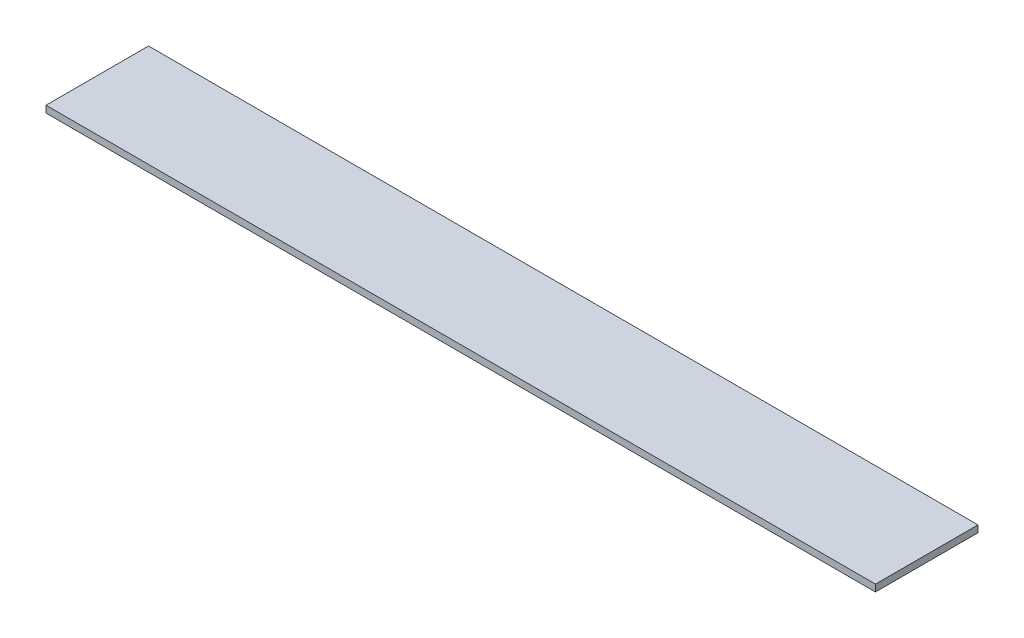
ISO-10303-21;
HEADER;
FILE_DESCRIPTION(('STEP AP214'),'2;1');
FILE_NAME('part.step','',(''),(''),'','','');
FILE_SCHEMA(('AUTOMOTIVE_DESIGN { 1 0 10303 214 1 1 1 1 }'));
ENDSEC;
DATA;
#1=APPLICATION_CONTEXT('core data for automotive mechanical design processes');
#2=APPLICATION_PROTOCOL_DEFINITION('international standard','automotive_design',2000,#1);
#3=PRODUCT_CONTEXT('',#1,'mechanical');
#4=PRODUCT('Part','Part','',(#3));
#5=PRODUCT_RELATED_PRODUCT_CATEGORY('part','',(#4));
#6=PRODUCT_DEFINITION_FORMATION('','',#4);
#7=PRODUCT_DEFINITION_CONTEXT('part definition',#1,'design');
#8=PRODUCT_DEFINITION('design','',#6,#7);
#9=PRODUCT_DEFINITION_SHAPE('','',#8);
#10=(LENGTH_UNIT() NAMED_UNIT(*) SI_UNIT(.MILLI.,.METRE.));
#11=(NAMED_UNIT(*) PLANE_ANGLE_UNIT() SI_UNIT($,.RADIAN.));
#12=(NAMED_UNIT(*) SI_UNIT($,.STERADIAN.) SOLID_ANGLE_UNIT());
#13=UNCERTAINTY_MEASURE_WITH_UNIT(LENGTH_MEASURE(1.E-05),#10,'distance_accuracy_value','');
#14=(GEOMETRIC_REPRESENTATION_CONTEXT(3) GLOBAL_UNCERTAINTY_ASSIGNED_CONTEXT((#13)) GLOBAL_UNIT_ASSIGNED_CONTEXT((#10,
#11,#12)) REPRESENTATION_CONTEXT('',''));
#15=CARTESIAN_POINT('',(0.,0.,0.));
#16=DIRECTION('',(0.,0.,1.));
#17=DIRECTION('',(1.,0.,0.));
#18=AXIS2_PLACEMENT_3D('',#15,#16,#17);
#19=CARTESIAN_POINT('',(-91.,0.75,22.5));
#20=DIRECTION('',(1.,0.,0.));
#21=DIRECTION('',(0.,0.,-1.));
#22=AXIS2_PLACEMENT_3D('',#19,#20,#21);
#23=PLANE('',#22);
#24=DIRECTION('',(0.,-1.,0.));
#25=VECTOR('',#24,1.);
#26=CARTESIAN_POINT('',(-91.,0.75,0.));
#27=LINE('',#26,#25);
#28=CARTESIAN_POINT('',(-91.,0.75,0.));
#29=VERTEX_POINT('',#28);
#30=CARTESIAN_POINT('',(-91.,-0.75,0.));
#31=VERTEX_POINT('',#30);
#32=EDGE_CURVE('E96',#29,#31,#27,.T.);
#33=ORIENTED_EDGE('',*,*,#32,.T.);
#34=DIRECTION('',(0.,0.,-1.));
#35=VECTOR('',#34,1.);
#36=CARTESIAN_POINT('',(-91.,-0.75,22.5));
#37=LINE('',#36,#35);
#38=CARTESIAN_POINT('',(-91.,-0.75,22.5));
#39=VERTEX_POINT('',#38);
#40=EDGE_CURVE('E11',#39,#31,#37,.T.);
#41=ORIENTED_EDGE('',*,*,#40,.F.);
#42=DIRECTION('',(0.,-1.,0.));
#43=VECTOR('',#42,1.);
#44=CARTESIAN_POINT('',(-91.,0.75,22.5));
#45=LINE('',#44,#43);
#46=CARTESIAN_POINT('',(-91.,0.75,22.5));
#47=VERTEX_POINT('',#46);
#48=EDGE_CURVE('E84',#47,#39,#45,.T.);
#49=ORIENTED_EDGE('',*,*,#48,.F.);
#50=DIRECTION('',(0.,0.,-1.));
#51=VECTOR('',#50,1.);
#52=CARTESIAN_POINT('',(-91.,0.75,22.5));
#53=LINE('',#52,#51);
#54=EDGE_CURVE('E92',#47,#29,#53,.T.);
#55=ORIENTED_EDGE('',*,*,#54,.T.);
#56=EDGE_LOOP('',(#33,#41,#49,#55));
#57=FACE_BOUND('',#56,.T.);
#58=ADVANCED_FACE('F33',(#57),#23,.F.);
#59=CARTESIAN_POINT('',(91.,-0.75,22.5));
#60=DIRECTION('',(0.,1.,0.));
#61=DIRECTION('',(0.,0.,1.));
#62=AXIS2_PLACEMENT_3D('',#59,#60,#61);
#63=PLANE('',#62);
#64=DIRECTION('',(1.,0.,0.));
#65=VECTOR('',#64,1.);
#66=CARTESIAN_POINT('',(91.,-0.75,0.));
#67=LINE('',#66,#65);
#68=CARTESIAN_POINT('',(91.,-0.75,0.));
#69=VERTEX_POINT('',#68);
#70=EDGE_CURVE('E88',#31,#69,#67,.T.);
#71=ORIENTED_EDGE('',*,*,#70,.T.);
#72=DIRECTION('',(0.,0.,-1.));
#73=VECTOR('',#72,1.);
#74=CARTESIAN_POINT('',(91.,-0.75,22.5));
#75=LINE('',#74,#73);
#76=CARTESIAN_POINT('',(91.,-0.75,22.5));
#77=VERTEX_POINT('',#76);
#78=EDGE_CURVE('E41',#77,#69,#75,.T.);
#79=ORIENTED_EDGE('',*,*,#78,.F.);
#80=DIRECTION('',(1.,0.,0.));
#81=VECTOR('',#80,1.);
#82=CARTESIAN_POINT('',(91.,-0.75,22.5));
#83=LINE('',#82,#81);
#84=EDGE_CURVE('E79',#39,#77,#83,.T.);
#85=ORIENTED_EDGE('',*,*,#84,.F.);
#86=ORIENTED_EDGE('',*,*,#40,.T.);
#87=EDGE_LOOP('',(#71,#79,#85,#86));
#88=FACE_BOUND('',#87,.T.);
#89=ADVANCED_FACE('F87',(#88),#63,.F.);
#90=CARTESIAN_POINT('',(91.,0.75,22.5));
#91=DIRECTION('',(-1.,0.,0.));
#92=DIRECTION('',(0.,0.,1.));
#93=AXIS2_PLACEMENT_3D('',#90,#91,#92);
#94=PLANE('',#93);
#95=DIRECTION('',(0.,1.,0.));
#96=VECTOR('',#95,1.);
#97=CARTESIAN_POINT('',(91.,0.75,0.));
#98=LINE('',#97,#96);
#99=CARTESIAN_POINT('',(91.,0.75,0.));
#100=VERTEX_POINT('',#99);
#101=EDGE_CURVE('E66',#69,#100,#98,.T.);
#102=ORIENTED_EDGE('',*,*,#101,.T.);
#103=DIRECTION('',(0.,0.,-1.));
#104=VECTOR('',#103,1.);
#105=CARTESIAN_POINT('',(91.,0.75,22.5));
#106=LINE('',#105,#104);
#107=CARTESIAN_POINT('',(91.,0.75,22.5));
#108=VERTEX_POINT('',#107);
#109=EDGE_CURVE('E89',#108,#100,#106,.T.);
#110=ORIENTED_EDGE('',*,*,#109,.F.);
#111=DIRECTION('',(0.,1.,0.));
#112=VECTOR('',#111,1.);
#113=CARTESIAN_POINT('',(91.,0.75,22.5));
#114=LINE('',#113,#112);
#115=EDGE_CURVE('E82',#77,#108,#114,.T.);
#116=ORIENTED_EDGE('',*,*,#115,.F.);
#117=ORIENTED_EDGE('',*,*,#78,.T.);
#118=EDGE_LOOP('',(#102,#110,#116,#117));
#119=FACE_BOUND('',#118,.T.);
#120=ADVANCED_FACE('F90',(#119),#94,.F.);
#121=CARTESIAN_POINT('',(91.,0.75,22.5));
#122=DIRECTION('',(0.,-1.,0.));
#123=DIRECTION('',(0.,0.,-1.));
#124=AXIS2_PLACEMENT_3D('',#121,#122,#123);
#125=PLANE('',#124);
#126=DIRECTION('',(-1.,0.,0.));
#127=VECTOR('',#126,1.);
#128=CARTESIAN_POINT('',(91.,0.75,0.));
#129=LINE('',#128,#127);
#130=EDGE_CURVE('E72',#100,#29,#129,.T.);
#131=ORIENTED_EDGE('',*,*,#130,.T.);
#132=ORIENTED_EDGE('',*,*,#54,.F.);
#133=DIRECTION('',(-1.,0.,0.));
#134=VECTOR('',#133,1.);
#135=CARTESIAN_POINT('',(91.,0.75,22.5));
#136=LINE('',#135,#134);
#137=EDGE_CURVE('E49',#108,#47,#136,.T.);
#138=ORIENTED_EDGE('',*,*,#137,.F.);
#139=ORIENTED_EDGE('',*,*,#109,.T.);
#140=EDGE_LOOP('',(#131,#132,#138,#139));
#141=FACE_BOUND('',#140,.T.);
#142=ADVANCED_FACE('F103',(#141),#125,.F.);
#143=CARTESIAN_POINT('',(0.,0.,22.5));
#144=DIRECTION('',(0.,0.,-1.));
#145=DIRECTION('',(-1.,0.,0.));
#146=AXIS2_PLACEMENT_3D('',#143,#144,#145);
#147=PLANE('',#146);
#148=ORIENTED_EDGE('',*,*,#48,.T.);
#149=ORIENTED_EDGE('',*,*,#84,.T.);
#150=ORIENTED_EDGE('',*,*,#115,.T.);
#151=ORIENTED_EDGE('',*,*,#137,.T.);
#152=EDGE_LOOP('',(#148,#149,#150,#151));
#153=FACE_BOUND('',#152,.T.);
#154=ADVANCED_FACE('F80',(#153),#147,.F.);
#155=CARTESIAN_POINT('',(0.,0.,0.));
#156=DIRECTION('',(0.,0.,-1.));
#157=DIRECTION('',(-1.,0.,0.));
#158=AXIS2_PLACEMENT_3D('',#155,#156,#157);
#159=PLANE('',#158);
#160=ORIENTED_EDGE('',*,*,#32,.F.);
#161=ORIENTED_EDGE('',*,*,#130,.F.);
#162=ORIENTED_EDGE('',*,*,#101,.F.);
#163=ORIENTED_EDGE('',*,*,#70,.F.);
#164=EDGE_LOOP('',(#160,#161,#162,#163));
#165=FACE_BOUND('',#164,.T.);
#166=ADVANCED_FACE('F106',(#165),#159,.T.);
#167=CLOSED_SHELL('',(#58,#89,#120,#142,#154,#166));
#168=MANIFOLD_SOLID_BREP('B2',#167);
#169=ADVANCED_BREP_SHAPE_REPRESENTATION('',(#18,#168),#14);
#170=SHAPE_DEFINITION_REPRESENTATION(#9,#169);
ENDSEC;
END-ISO-10303-21;
